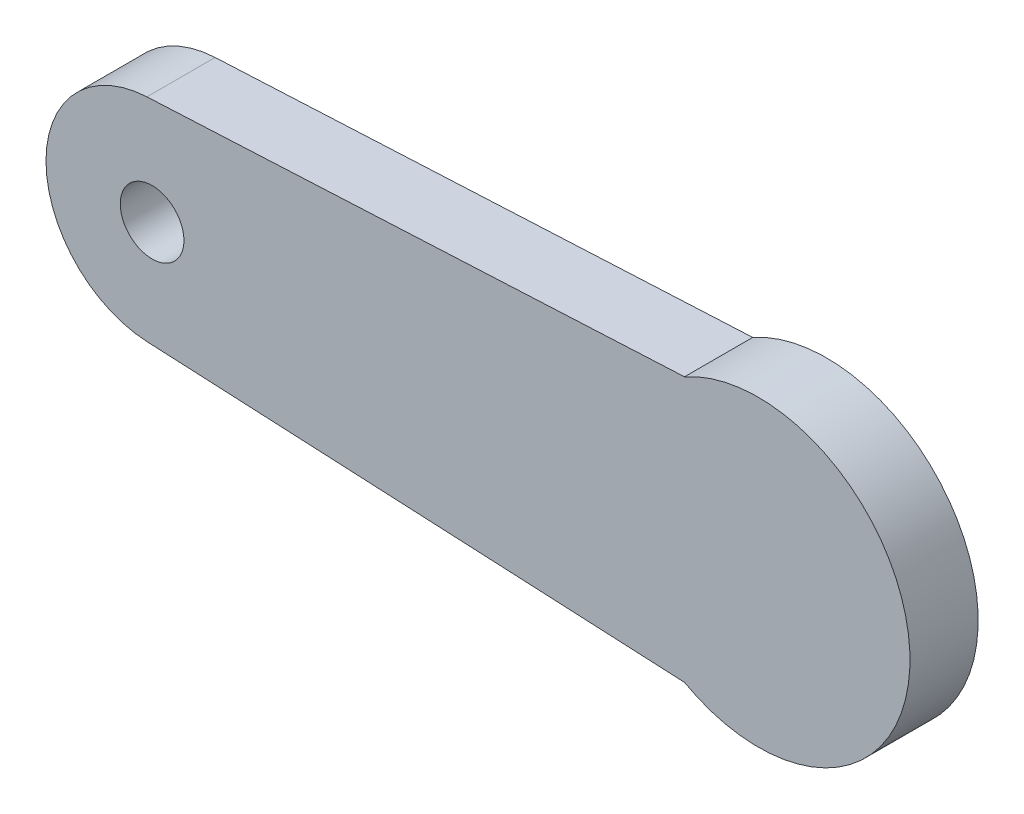
ISO-10303-21;
HEADER;
FILE_DESCRIPTION(('STEP AP214'),'2;1');
FILE_NAME('part.step','',(''),(''),'','','');
FILE_SCHEMA(('AUTOMOTIVE_DESIGN { 1 0 10303 214 1 1 1 1 }'));
ENDSEC;
DATA;
#1=APPLICATION_CONTEXT('core data for automotive mechanical design processes');
#2=APPLICATION_PROTOCOL_DEFINITION('international standard','automotive_design',2000,#1);
#3=PRODUCT_CONTEXT('',#1,'mechanical');
#4=PRODUCT('Part','Part','',(#3));
#5=PRODUCT_RELATED_PRODUCT_CATEGORY('part','',(#4));
#6=PRODUCT_DEFINITION_FORMATION('','',#4);
#7=PRODUCT_DEFINITION_CONTEXT('part definition',#1,'design');
#8=PRODUCT_DEFINITION('design','',#6,#7);
#9=PRODUCT_DEFINITION_SHAPE('','',#8);
#10=(LENGTH_UNIT() NAMED_UNIT(*) SI_UNIT(.MILLI.,.METRE.));
#11=(NAMED_UNIT(*) PLANE_ANGLE_UNIT() SI_UNIT($,.RADIAN.));
#12=(NAMED_UNIT(*) SI_UNIT($,.STERADIAN.) SOLID_ANGLE_UNIT());
#13=UNCERTAINTY_MEASURE_WITH_UNIT(LENGTH_MEASURE(1.E-05),#10,'distance_accuracy_value','');
#14=(GEOMETRIC_REPRESENTATION_CONTEXT(3) GLOBAL_UNCERTAINTY_ASSIGNED_CONTEXT((#13)) GLOBAL_UNIT_ASSIGNED_CONTEXT((#10,
#11,#12)) REPRESENTATION_CONTEXT('',''));
#15=CARTESIAN_POINT('',(0.,0.,0.));
#16=DIRECTION('',(0.,0.,1.));
#17=DIRECTION('',(1.,0.,0.));
#18=AXIS2_PLACEMENT_3D('',#15,#16,#17);
#19=CARTESIAN_POINT('',(0.,0.,-2.));
#20=DIRECTION('',(0.,0.,1.));
#21=DIRECTION('',(1.,0.,0.));
#22=AXIS2_PLACEMENT_3D('',#19,#20,#21);
#23=PLANE('',#22);
#24=CARTESIAN_POINT('',(-20.,0.,-2.));
#25=DIRECTION('',(0.,0.,-1.));
#26=DIRECTION('',(-1.,0.,0.));
#27=AXIS2_PLACEMENT_3D('',#24,#25,#26);
#28=CIRCLE('',#27,2.1);
#29=CARTESIAN_POINT('',(-22.1,0.,-2.));
#30=VERTEX_POINT('',#29);
#31=EDGE_CURVE('E146',#30,#30,#28,.T.);
#32=ORIENTED_EDGE('',*,*,#31,.F.);
#33=EDGE_LOOP('',(#32));
#34=FACE_BOUND('',#33,.T.);
#35=DIRECTION('',(-0.998799863595605,0.0489778774693291,0.));
#36=VECTOR('',#35,1.);
#37=CARTESIAN_POINT('',(-0.390821791913316,-7.9699809918806,-2.));
#38=LINE('',#37,#36);
#39=CARTESIAN_POINT('',(15.1242073651907,-8.73078726016957,-2.));
#40=VERTEX_POINT('',#39);
#41=CARTESIAN_POINT('',(-20.3428451422853,-6.99159904516924,-2.));
#42=VERTEX_POINT('',#41);
#43=EDGE_CURVE('E50',#40,#42,#38,.T.);
#44=ORIENTED_EDGE('',*,*,#43,.T.);
#45=CARTESIAN_POINT('',(-20.,0.,-2.));
#46=DIRECTION('',(0.,0.,1.));
#47=DIRECTION('',(1.,0.,0.));
#48=AXIS2_PLACEMENT_3D('',#45,#46,#47);
#49=CIRCLE('',#48,7.);
#50=CARTESIAN_POINT('',(-20.3428451422853,6.99159904516924,-2.));
#51=VERTEX_POINT('',#50);
#52=EDGE_CURVE('E66',#42,#51,#49,.F.);
#53=ORIENTED_EDGE('',*,*,#52,.T.);
#54=DIRECTION('',(-0.998799863595605,-0.0489778774693291,0.));
#55=VECTOR('',#54,1.);
#56=CARTESIAN_POINT('',(-0.390821791913316,7.9699809918806,-2.));
#57=LINE('',#56,#55);
#58=CARTESIAN_POINT('',(15.1242073651907,8.73078726016958,-2.));
#59=VERTEX_POINT('',#58);
#60=EDGE_CURVE('E126',#59,#51,#57,.T.);
#61=ORIENTED_EDGE('',*,*,#60,.F.);
#62=CARTESIAN_POINT('',(20.,0.,-2.));
#63=DIRECTION('',(0.,0.,1.));
#64=DIRECTION('',(1.,0.,0.));
#65=AXIS2_PLACEMENT_3D('',#62,#63,#64);
#66=CIRCLE('',#65,10.);
#67=EDGE_CURVE('E11',#59,#40,#66,.F.);
#68=ORIENTED_EDGE('',*,*,#67,.T.);
#69=EDGE_LOOP('',(#44,#53,#61,#68));
#70=FACE_BOUND('',#69,.T.);
#71=CARTESIAN_POINT('',(8.,-16.5115384615384,-2.));
#72=DIRECTION('',(0.,0.,1.));
#73=DIRECTION('',(1.,0.,0.));
#74=AXIS2_PLACEMENT_3D('',#71,#72,#73);
#75=CIRCLE('',#74,13.0115384615384);
#76=CARTESIAN_POINT('',(15.6495195025438,-5.98609383832673,-2.));
#77=VERTEX_POINT('',#76);
#78=CARTESIAN_POINT('',(8.,-3.49999999999999,-2.));
#79=VERTEX_POINT('',#78);
#80=EDGE_CURVE('E171',#77,#79,#75,.T.);
#81=ORIENTED_EDGE('',*,*,#80,.F.);
#82=CARTESIAN_POINT('',(20.,0.,-2.));
#83=DIRECTION('',(0.,0.,-1.));
#84=DIRECTION('',(-1.,0.,0.));
#85=AXIS2_PLACEMENT_3D('',#82,#83,#84);
#86=CIRCLE('',#85,7.4);
#87=CARTESIAN_POINT('',(15.6495195025438,5.98609383832674,-2.));
#88=VERTEX_POINT('',#87);
#89=EDGE_CURVE('E57',#88,#77,#86,.T.);
#90=ORIENTED_EDGE('',*,*,#89,.F.);
#91=CARTESIAN_POINT('',(8.,16.5115384615384,-2.));
#92=DIRECTION('',(0.,0.,-1.));
#93=DIRECTION('',(-1.,0.,0.));
#94=AXIS2_PLACEMENT_3D('',#91,#92,#93);
#95=CIRCLE('',#94,13.0115384615384);
#96=CARTESIAN_POINT('',(8.,3.49999999999999,-2.));
#97=VERTEX_POINT('',#96);
#98=EDGE_CURVE('E156',#88,#97,#95,.T.);
#99=ORIENTED_EDGE('',*,*,#98,.T.);
#100=DIRECTION('',(-1.,0.,0.));
#101=VECTOR('',#100,1.);
#102=CARTESIAN_POINT('',(8.,3.49999999999999,-2.));
#103=LINE('',#102,#101);
#104=CARTESIAN_POINT('',(-4.,3.49999999999999,-2.));
#105=VERTEX_POINT('',#104);
#106=EDGE_CURVE('E180',#97,#105,#103,.T.);
#107=ORIENTED_EDGE('',*,*,#106,.T.);
#108=CARTESIAN_POINT('',(-4.,0.,-2.));
#109=DIRECTION('',(0.,0.,-1.));
#110=DIRECTION('',(-1.,0.,0.));
#111=AXIS2_PLACEMENT_3D('',#108,#109,#110);
#112=CIRCLE('',#111,3.5);
#113=CARTESIAN_POINT('',(-4.,-3.5,-2.));
#114=VERTEX_POINT('',#113);
#115=EDGE_CURVE('E177',#114,#105,#112,.T.);
#116=ORIENTED_EDGE('',*,*,#115,.F.);
#117=DIRECTION('',(-1.,0.,0.));
#118=VECTOR('',#117,1.);
#119=CARTESIAN_POINT('',(8.,-3.49999999999999,-2.));
#120=LINE('',#119,#118);
#121=EDGE_CURVE('E174',#79,#114,#120,.T.);
#122=ORIENTED_EDGE('',*,*,#121,.F.);
#123=EDGE_LOOP('',(#81,#90,#99,#107,#116,#122));
#124=FACE_BOUND('',#123,.T.);
#125=ADVANCED_FACE('F43',(#34,#70,#124),#23,.F.);
#126=CARTESIAN_POINT('',(-0.390821791913316,-7.9699809918806,-62.4069532421558));
#127=DIRECTION('',(-0.0489778774693291,-0.998799863595605,0.));
#128=DIRECTION('',(0.998799863595605,-0.0489778774693291,0.));
#129=AXIS2_PLACEMENT_3D('',#126,#127,#128);
#130=PLANE('',#129);
#131=ORIENTED_EDGE('',*,*,#43,.F.);
#132=DIRECTION('',(0.,0.,1.));
#133=VECTOR('',#132,1.);
#134=CARTESIAN_POINT('',(15.1242073651907,-8.73078726016957,-62.4069532421558));
#135=LINE('',#134,#133);
#136=CARTESIAN_POINT('',(15.1242073651907,-8.73078726016958,2.5));
#137=VERTEX_POINT('',#136);
#138=EDGE_CURVE('E133',#40,#137,#135,.T.);
#139=ORIENTED_EDGE('',*,*,#138,.T.);
#140=DIRECTION('',(0.998799863595605,-0.0489778774693291,0.));
#141=VECTOR('',#140,1.);
#142=CARTESIAN_POINT('',(-0.390821791913316,-7.9699809918806,2.5));
#143=LINE('',#142,#141);
#144=CARTESIAN_POINT('',(-20.3428451422853,-6.99159904516924,2.5));
#145=VERTEX_POINT('',#144);
#146=EDGE_CURVE('E130',#145,#137,#143,.T.);
#147=ORIENTED_EDGE('',*,*,#146,.F.);
#148=DIRECTION('',(0.,0.,1.));
#149=VECTOR('',#148,1.);
#150=CARTESIAN_POINT('',(-20.3428451422853,-6.99159904516924,-62.4069532421558));
#151=LINE('',#150,#149);
#152=EDGE_CURVE('E118',#42,#145,#151,.T.);
#153=ORIENTED_EDGE('',*,*,#152,.F.);
#154=EDGE_LOOP('',(#131,#139,#147,#153));
#155=FACE_BOUND('',#154,.T.);
#156=ADVANCED_FACE('F131',(#155),#130,.T.);
#157=CARTESIAN_POINT('',(-20.,0.,-62.4069532421558));
#158=DIRECTION('',(0.,0.,1.));
#159=DIRECTION('',(1.,0.,0.));
#160=AXIS2_PLACEMENT_3D('',#157,#158,#159);
#161=CYLINDRICAL_SURFACE('',#160,7.);
#162=ORIENTED_EDGE('',*,*,#52,.F.);
#163=ORIENTED_EDGE('',*,*,#152,.T.);
#164=CARTESIAN_POINT('',(-20.,0.,2.5));
#165=DIRECTION('',(0.,0.,1.));
#166=DIRECTION('',(1.,0.,0.));
#167=AXIS2_PLACEMENT_3D('',#164,#165,#166);
#168=CIRCLE('',#167,7.);
#169=CARTESIAN_POINT('',(-20.3428451422853,6.99159904516924,2.5));
#170=VERTEX_POINT('',#169);
#171=EDGE_CURVE('E123',#170,#145,#168,.T.);
#172=ORIENTED_EDGE('',*,*,#171,.F.);
#173=DIRECTION('',(0.,0.,1.));
#174=VECTOR('',#173,1.);
#175=CARTESIAN_POINT('',(-20.3428451422853,6.99159904516924,-62.4069532421558));
#176=LINE('',#175,#174);
#177=EDGE_CURVE('E127',#51,#170,#176,.T.);
#178=ORIENTED_EDGE('',*,*,#177,.F.);
#179=EDGE_LOOP('',(#162,#163,#172,#178));
#180=FACE_BOUND('',#179,.T.);
#181=ADVANCED_FACE('F120',(#180),#161,.T.);
#182=CARTESIAN_POINT('',(-0.390821791913316,7.9699809918806,-62.4069532421558));
#183=DIRECTION('',(0.0489778774693291,-0.998799863595605,0.));
#184=DIRECTION('',(0.998799863595605,0.0489778774693291,0.));
#185=AXIS2_PLACEMENT_3D('',#182,#183,#184);
#186=PLANE('',#185);
#187=DIRECTION('',(0.,0.,1.));
#188=VECTOR('',#187,1.);
#189=CARTESIAN_POINT('',(15.1242073651907,8.73078726016958,-62.4069532421558));
#190=LINE('',#189,#188);
#191=CARTESIAN_POINT('',(15.1242073651907,8.73078726016958,2.5));
#192=VERTEX_POINT('',#191);
#193=EDGE_CURVE('E200',#59,#192,#190,.T.);
#194=ORIENTED_EDGE('',*,*,#193,.F.);
#195=ORIENTED_EDGE('',*,*,#60,.T.);
#196=ORIENTED_EDGE('',*,*,#177,.T.);
#197=DIRECTION('',(-0.998799863595605,-0.0489778774693291,0.));
#198=VECTOR('',#197,1.);
#199=CARTESIAN_POINT('',(-0.390821791913316,7.9699809918806,2.5));
#200=LINE('',#199,#198);
#201=EDGE_CURVE('E142',#192,#170,#200,.T.);
#202=ORIENTED_EDGE('',*,*,#201,.F.);
#203=EDGE_LOOP('',(#194,#195,#196,#202));
#204=FACE_BOUND('',#203,.T.);
#205=ADVANCED_FACE('F206',(#204),#186,.F.);
#206=CARTESIAN_POINT('',(20.,0.,-62.4069532421558));
#207=DIRECTION('',(0.,0.,1.));
#208=DIRECTION('',(1.,0.,0.));
#209=AXIS2_PLACEMENT_3D('',#206,#207,#208);
#210=CYLINDRICAL_SURFACE('',#209,10.);
#211=ORIENTED_EDGE('',*,*,#67,.F.);
#212=ORIENTED_EDGE('',*,*,#193,.T.);
#213=CARTESIAN_POINT('',(20.,0.,2.5));
#214=DIRECTION('',(0.,0.,1.));
#215=DIRECTION('',(1.,0.,0.));
#216=AXIS2_PLACEMENT_3D('',#213,#214,#215);
#217=CIRCLE('',#216,10.);
#218=EDGE_CURVE('E137',#137,#192,#217,.T.);
#219=ORIENTED_EDGE('',*,*,#218,.F.);
#220=ORIENTED_EDGE('',*,*,#138,.F.);
#221=EDGE_LOOP('',(#211,#212,#219,#220));
#222=FACE_BOUND('',#221,.T.);
#223=ADVANCED_FACE('F204',(#222),#210,.T.);
#224=CARTESIAN_POINT('',(20.,0.,1.15));
#225=DIRECTION('',(0.,0.,-1.));
#226=DIRECTION('',(-1.,0.,0.));
#227=AXIS2_PLACEMENT_3D('',#224,#225,#226);
#228=CYLINDRICAL_SURFACE('',#227,7.4);
#229=ORIENTED_EDGE('',*,*,#89,.T.);
#230=DIRECTION('',(0.,0.,-1.));
#231=VECTOR('',#230,1.);
#232=CARTESIAN_POINT('',(15.6495195025438,-5.98609383832673,1.15));
#233=LINE('',#232,#231);
#234=CARTESIAN_POINT('',(15.6495195025438,-5.98609383832673,1.15));
#235=VERTEX_POINT('',#234);
#236=EDGE_CURVE('E169',#235,#77,#233,.T.);
#237=ORIENTED_EDGE('',*,*,#236,.F.);
#238=CARTESIAN_POINT('',(20.,0.,1.15));
#239=DIRECTION('',(0.,0.,-1.));
#240=DIRECTION('',(-1.,0.,0.));
#241=AXIS2_PLACEMENT_3D('',#238,#239,#240);
#242=CIRCLE('',#241,7.4);
#243=CARTESIAN_POINT('',(15.6495195025438,5.98609383832674,1.15));
#244=VERTEX_POINT('',#243);
#245=EDGE_CURVE('E152',#244,#235,#242,.T.);
#246=ORIENTED_EDGE('',*,*,#245,.F.);
#247=DIRECTION('',(0.,0.,-1.));
#248=VECTOR('',#247,1.);
#249=CARTESIAN_POINT('',(15.6495195025438,5.98609383832674,1.15));
#250=LINE('',#249,#248);
#251=EDGE_CURVE('E185',#244,#88,#250,.T.);
#252=ORIENTED_EDGE('',*,*,#251,.T.);
#253=EDGE_LOOP('',(#229,#237,#246,#252));
#254=FACE_BOUND('',#253,.T.);
#255=ADVANCED_FACE('F218',(#254),#228,.F.);
#256=CARTESIAN_POINT('',(8.,16.5115384615384,1.15));
#257=DIRECTION('',(0.,0.,-1.));
#258=DIRECTION('',(-1.,0.,0.));
#259=AXIS2_PLACEMENT_3D('',#256,#257,#258);
#260=CYLINDRICAL_SURFACE('',#259,13.0115384615384);
#261=ORIENTED_EDGE('',*,*,#98,.F.);
#262=ORIENTED_EDGE('',*,*,#251,.F.);
#263=CARTESIAN_POINT('',(8.,16.5115384615384,1.15));
#264=DIRECTION('',(0.,0.,-1.));
#265=DIRECTION('',(-1.,0.,0.));
#266=AXIS2_PLACEMENT_3D('',#263,#264,#265);
#267=CIRCLE('',#266,13.0115384615384);
#268=CARTESIAN_POINT('',(8.,3.49999999999999,1.15));
#269=VERTEX_POINT('',#268);
#270=EDGE_CURVE('E167',#244,#269,#267,.T.);
#271=ORIENTED_EDGE('',*,*,#270,.T.);
#272=DIRECTION('',(0.,0.,-1.));
#273=VECTOR('',#272,1.);
#274=CARTESIAN_POINT('',(8.,3.49999999999999,1.15));
#275=LINE('',#274,#273);
#276=EDGE_CURVE('E187',#269,#97,#275,.T.);
#277=ORIENTED_EDGE('',*,*,#276,.T.);
#278=EDGE_LOOP('',(#261,#262,#271,#277));
#279=FACE_BOUND('',#278,.T.);
#280=ADVANCED_FACE('F226',(#279),#260,.T.);
#281=CARTESIAN_POINT('',(8.,3.49999999999999,1.15));
#282=DIRECTION('',(0.,-1.,0.));
#283=DIRECTION('',(1.,0.,0.));
#284=AXIS2_PLACEMENT_3D('',#281,#282,#283);
#285=PLANE('',#284);
#286=ORIENTED_EDGE('',*,*,#106,.F.);
#287=ORIENTED_EDGE('',*,*,#276,.F.);
#288=DIRECTION('',(-1.,0.,0.));
#289=VECTOR('',#288,1.);
#290=CARTESIAN_POINT('',(8.,3.49999999999999,1.15));
#291=LINE('',#290,#289);
#292=CARTESIAN_POINT('',(-4.,3.49999999999999,1.15));
#293=VERTEX_POINT('',#292);
#294=EDGE_CURVE('E165',#269,#293,#291,.T.);
#295=ORIENTED_EDGE('',*,*,#294,.T.);
#296=DIRECTION('',(0.,0.,-1.));
#297=VECTOR('',#296,1.);
#298=CARTESIAN_POINT('',(-4.,3.49999999999999,1.15));
#299=LINE('',#298,#297);
#300=EDGE_CURVE('E189',#293,#105,#299,.T.);
#301=ORIENTED_EDGE('',*,*,#300,.T.);
#302=EDGE_LOOP('',(#286,#287,#295,#301));
#303=FACE_BOUND('',#302,.T.);
#304=ADVANCED_FACE('F229',(#303),#285,.T.);
#305=CARTESIAN_POINT('',(-4.,0.,1.15));
#306=DIRECTION('',(0.,0.,-1.));
#307=DIRECTION('',(-1.,0.,0.));
#308=AXIS2_PLACEMENT_3D('',#305,#306,#307);
#309=CYLINDRICAL_SURFACE('',#308,3.5);
#310=ORIENTED_EDGE('',*,*,#115,.T.);
#311=ORIENTED_EDGE('',*,*,#300,.F.);
#312=CARTESIAN_POINT('',(-4.,0.,1.15));
#313=DIRECTION('',(0.,0.,-1.));
#314=DIRECTION('',(-1.,0.,0.));
#315=AXIS2_PLACEMENT_3D('',#312,#313,#314);
#316=CIRCLE('',#315,3.5);
#317=CARTESIAN_POINT('',(-4.,-3.5,1.15));
#318=VERTEX_POINT('',#317);
#319=EDGE_CURVE('E162',#318,#293,#316,.T.);
#320=ORIENTED_EDGE('',*,*,#319,.F.);
#321=DIRECTION('',(0.,0.,-1.));
#322=VECTOR('',#321,1.);
#323=CARTESIAN_POINT('',(-4.,-3.5,1.15));
#324=LINE('',#323,#322);
#325=EDGE_CURVE('E191',#318,#114,#324,.T.);
#326=ORIENTED_EDGE('',*,*,#325,.T.);
#327=EDGE_LOOP('',(#310,#311,#320,#326));
#328=FACE_BOUND('',#327,.T.);
#329=ADVANCED_FACE('F232',(#328),#309,.F.);
#330=CARTESIAN_POINT('',(8.,-3.49999999999999,1.15));
#331=DIRECTION('',(0.,-1.,0.));
#332=DIRECTION('',(1.,0.,0.));
#333=AXIS2_PLACEMENT_3D('',#330,#331,#332);
#334=PLANE('',#333);
#335=ORIENTED_EDGE('',*,*,#121,.T.);
#336=ORIENTED_EDGE('',*,*,#325,.F.);
#337=DIRECTION('',(-1.,0.,0.));
#338=VECTOR('',#337,1.);
#339=CARTESIAN_POINT('',(8.,-3.49999999999999,1.15));
#340=LINE('',#339,#338);
#341=CARTESIAN_POINT('',(8.,-3.49999999999999,1.15));
#342=VERTEX_POINT('',#341);
#343=EDGE_CURVE('E159',#342,#318,#340,.T.);
#344=ORIENTED_EDGE('',*,*,#343,.F.);
#345=DIRECTION('',(0.,0.,-1.));
#346=VECTOR('',#345,1.);
#347=CARTESIAN_POINT('',(8.,-3.49999999999999,1.15));
#348=LINE('',#347,#346);
#349=EDGE_CURVE('E193',#342,#79,#348,.T.);
#350=ORIENTED_EDGE('',*,*,#349,.T.);
#351=EDGE_LOOP('',(#335,#336,#344,#350));
#352=FACE_BOUND('',#351,.T.);
#353=ADVANCED_FACE('F235',(#352),#334,.F.);
#354=CARTESIAN_POINT('',(8.,-16.5115384615384,1.15));
#355=DIRECTION('',(0.,0.,-1.));
#356=DIRECTION('',(-1.,0.,0.));
#357=AXIS2_PLACEMENT_3D('',#354,#355,#356);
#358=CYLINDRICAL_SURFACE('',#357,13.0115384615384);
#359=ORIENTED_EDGE('',*,*,#80,.T.);
#360=ORIENTED_EDGE('',*,*,#349,.F.);
#361=CARTESIAN_POINT('',(8.,-16.5115384615384,1.15));
#362=DIRECTION('',(0.,0.,1.));
#363=DIRECTION('',(1.,0.,0.));
#364=AXIS2_PLACEMENT_3D('',#361,#362,#363);
#365=CIRCLE('',#364,13.0115384615384);
#366=EDGE_CURVE('E155',#235,#342,#365,.T.);
#367=ORIENTED_EDGE('',*,*,#366,.F.);
#368=ORIENTED_EDGE('',*,*,#236,.T.);
#369=EDGE_LOOP('',(#359,#360,#367,#368));
#370=FACE_BOUND('',#369,.T.);
#371=ADVANCED_FACE('F214',(#370),#358,.T.);
#372=CARTESIAN_POINT('',(20.,0.,1.15));
#373=DIRECTION('',(0.,0.,-1.));
#374=DIRECTION('',(-1.,0.,0.));
#375=AXIS2_PLACEMENT_3D('',#372,#373,#374);
#376=PLANE('',#375);
#377=ORIENTED_EDGE('',*,*,#245,.T.);
#378=ORIENTED_EDGE('',*,*,#366,.T.);
#379=ORIENTED_EDGE('',*,*,#343,.T.);
#380=ORIENTED_EDGE('',*,*,#319,.T.);
#381=ORIENTED_EDGE('',*,*,#294,.F.);
#382=ORIENTED_EDGE('',*,*,#270,.F.);
#383=EDGE_LOOP('',(#377,#378,#379,#380,#381,#382));
#384=FACE_BOUND('',#383,.T.);
#385=ADVANCED_FACE('F222',(#384),#376,.T.);
#386=CARTESIAN_POINT('',(0.,0.,2.5));
#387=DIRECTION('',(0.,0.,1.));
#388=DIRECTION('',(1.,0.,0.));
#389=AXIS2_PLACEMENT_3D('',#386,#387,#388);
#390=PLANE('',#389);
#391=CARTESIAN_POINT('',(-20.,0.,2.5));
#392=DIRECTION('',(0.,0.,-1.));
#393=DIRECTION('',(-1.,0.,0.));
#394=AXIS2_PLACEMENT_3D('',#391,#392,#393);
#395=CIRCLE('',#394,2.1);
#396=CARTESIAN_POINT('',(-22.1,0.,2.5));
#397=VERTEX_POINT('',#396);
#398=EDGE_CURVE('E143',#397,#397,#395,.T.);
#399=ORIENTED_EDGE('',*,*,#398,.T.);
#400=EDGE_LOOP('',(#399));
#401=FACE_BOUND('',#400,.T.);
#402=ORIENTED_EDGE('',*,*,#171,.T.);
#403=ORIENTED_EDGE('',*,*,#146,.T.);
#404=ORIENTED_EDGE('',*,*,#218,.T.);
#405=ORIENTED_EDGE('',*,*,#201,.T.);
#406=EDGE_LOOP('',(#402,#403,#404,#405));
#407=FACE_BOUND('',#406,.T.);
#408=ADVANCED_FACE('F140',(#401,#407),#390,.T.);
#409=CARTESIAN_POINT('',(-20.,0.,2.5));
#410=DIRECTION('',(0.,0.,-1.));
#411=DIRECTION('',(-1.,0.,0.));
#412=AXIS2_PLACEMENT_3D('',#409,#410,#411);
#413=CYLINDRICAL_SURFACE('',#412,2.1);
#414=ORIENTED_EDGE('',*,*,#398,.F.);
#415=EDGE_LOOP('',(#414));
#416=FACE_BOUND('',#415,.T.);
#417=ORIENTED_EDGE('',*,*,#31,.T.);
#418=EDGE_LOOP('',(#417));
#419=FACE_BOUND('',#418,.T.);
#420=ADVANCED_FACE('F288',(#416,#419),#413,.F.);
#421=CLOSED_SHELL('',(#125,#156,#181,#205,#223,#255,#280,#304,#329,#353,#371,#385,#408,#420));
#422=MANIFOLD_SOLID_BREP('B2',#421);
#423=ADVANCED_BREP_SHAPE_REPRESENTATION('',(#18,#422),#14);
#424=SHAPE_DEFINITION_REPRESENTATION(#9,#423);
ENDSEC;
END-ISO-10303-21;
